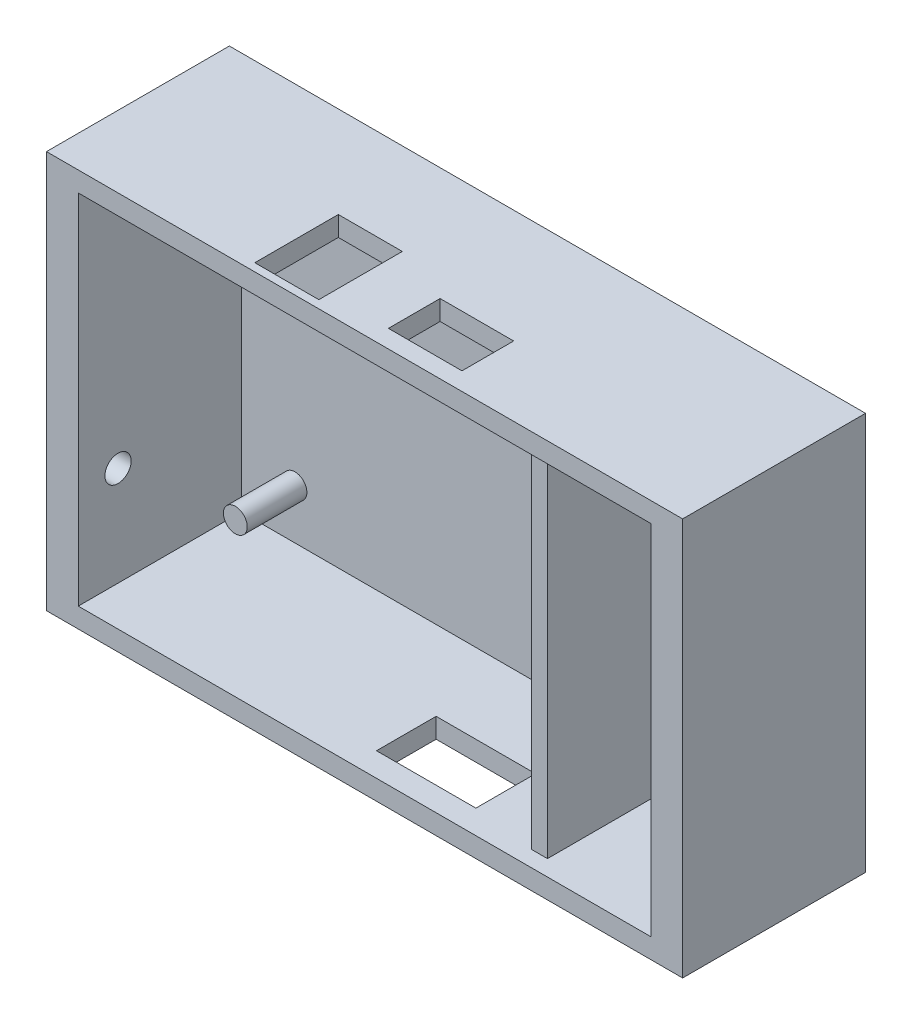
ISO-10303-21;
HEADER;
FILE_DESCRIPTION(('STEP AP214'),'2;1');
FILE_NAME('part.step','',(''),(''),'','','');
FILE_SCHEMA(('AUTOMOTIVE_DESIGN { 1 0 10303 214 1 1 1 1 }'));
ENDSEC;
DATA;
#1=APPLICATION_CONTEXT('core data for automotive mechanical design processes');
#2=APPLICATION_PROTOCOL_DEFINITION('international standard','automotive_design',2000,#1);
#3=PRODUCT_CONTEXT('',#1,'mechanical');
#4=PRODUCT('Part','Part','',(#3));
#5=PRODUCT_RELATED_PRODUCT_CATEGORY('part','',(#4));
#6=PRODUCT_DEFINITION_FORMATION('','',#4);
#7=PRODUCT_DEFINITION_CONTEXT('part definition',#1,'design');
#8=PRODUCT_DEFINITION('design','',#6,#7);
#9=PRODUCT_DEFINITION_SHAPE('','',#8);
#10=(LENGTH_UNIT() NAMED_UNIT(*) SI_UNIT(.MILLI.,.METRE.));
#11=(NAMED_UNIT(*) PLANE_ANGLE_UNIT() SI_UNIT($,.RADIAN.));
#12=(NAMED_UNIT(*) SI_UNIT($,.STERADIAN.) SOLID_ANGLE_UNIT());
#13=UNCERTAINTY_MEASURE_WITH_UNIT(LENGTH_MEASURE(1.E-05),#10,'distance_accuracy_value','');
#14=(GEOMETRIC_REPRESENTATION_CONTEXT(3) GLOBAL_UNCERTAINTY_ASSIGNED_CONTEXT((#13)) GLOBAL_UNIT_ASSIGNED_CONTEXT((#10,
#11,#12)) REPRESENTATION_CONTEXT('',''));
#15=CARTESIAN_POINT('',(0.,0.,0.));
#16=DIRECTION('',(0.,0.,1.));
#17=DIRECTION('',(1.,0.,0.));
#18=AXIS2_PLACEMENT_3D('',#15,#16,#17);
#19=CARTESIAN_POINT('',(72.,45.,46.));
#20=DIRECTION('',(0.,-1.,0.));
#21=DIRECTION('',(1.,0.,0.));
#22=AXIS2_PLACEMENT_3D('',#19,#20,#21);
#23=PLANE('',#22);
#24=DIRECTION('',(-1.,0.,0.));
#25=VECTOR('',#24,1.);
#26=CARTESIAN_POINT('',(-72.,45.,5.));
#27=LINE('',#26,#25);
#28=CARTESIAN_POINT('',(38.,45.,5.00000000000001));
#29=VERTEX_POINT('',#28);
#30=CARTESIAN_POINT('',(-72.,45.,5.));
#31=VERTEX_POINT('',#30);
#32=EDGE_CURVE('E354',#29,#31,#27,.T.);
#33=ORIENTED_EDGE('',*,*,#32,.F.);
#34=DIRECTION('',(0.,0.,-1.));
#35=VECTOR('',#34,1.);
#36=CARTESIAN_POINT('',(38.,45.,42.));
#37=LINE('',#36,#35);
#38=CARTESIAN_POINT('',(38.,45.,42.));
#39=VERTEX_POINT('',#38);
#40=EDGE_CURVE('E370',#39,#29,#37,.T.);
#41=ORIENTED_EDGE('',*,*,#40,.F.);
#42=DIRECTION('',(-1.,0.,0.));
#43=VECTOR('',#42,1.);
#44=CARTESIAN_POINT('',(38.,45.,42.));
#45=LINE('',#44,#43);
#46=CARTESIAN_POINT('',(42.,45.,42.));
#47=VERTEX_POINT('',#46);
#48=EDGE_CURVE('E373',#47,#39,#45,.T.);
#49=ORIENTED_EDGE('',*,*,#48,.F.);
#50=DIRECTION('',(0.,0.,-1.));
#51=VECTOR('',#50,1.);
#52=CARTESIAN_POINT('',(42.,45.,42.));
#53=LINE('',#52,#51);
#54=CARTESIAN_POINT('',(42.,45.,5.00000000000001));
#55=VERTEX_POINT('',#54);
#56=EDGE_CURVE('E366',#47,#55,#53,.T.);
#57=ORIENTED_EDGE('',*,*,#56,.T.);
#58=CARTESIAN_POINT('',(72.,45.,5.));
#59=VERTEX_POINT('',#58);
#60=EDGE_CURVE('E350',#59,#55,#27,.T.);
#61=ORIENTED_EDGE('',*,*,#60,.F.);
#62=DIRECTION('',(0.,0.,-1.));
#63=VECTOR('',#62,1.);
#64=CARTESIAN_POINT('',(72.,45.,46.));
#65=LINE('',#64,#63);
#66=CARTESIAN_POINT('',(72.,45.,46.));
#67=VERTEX_POINT('',#66);
#68=EDGE_CURVE('E320',#67,#59,#65,.T.);
#69=ORIENTED_EDGE('',*,*,#68,.F.);
#70=DIRECTION('',(-1.,0.,0.));
#71=VECTOR('',#70,1.);
#72=CARTESIAN_POINT('',(72.,45.,46.));
#73=LINE('',#72,#71);
#74=CARTESIAN_POINT('',(-72.,45.,46.));
#75=VERTEX_POINT('',#74);
#76=EDGE_CURVE('E328',#67,#75,#73,.T.);
#77=ORIENTED_EDGE('',*,*,#76,.T.);
#78=DIRECTION('',(0.,0.,-1.));
#79=VECTOR('',#78,1.);
#80=CARTESIAN_POINT('',(-72.,45.,46.));
#81=LINE('',#80,#79);
#82=EDGE_CURVE('E324',#75,#31,#81,.T.);
#83=ORIENTED_EDGE('',*,*,#82,.T.);
#84=EDGE_LOOP('',(#33,#41,#49,#57,#61,#69,#77,#83));
#85=FACE_BOUND('',#84,.T.);
#86=DIRECTION('',(-1.,0.,0.));
#87=VECTOR('',#86,1.);
#88=CARTESIAN_POINT('',(72.,45.,28.5));
#89=LINE('',#88,#87);
#90=CARTESIAN_POINT('',(20.,45.,28.5));
#91=VERTEX_POINT('',#90);
#92=CARTESIAN_POINT('',(1.5,45.,28.5));
#93=VERTEX_POINT('',#92);
#94=EDGE_CURVE('E399',#91,#93,#89,.T.);
#95=ORIENTED_EDGE('',*,*,#94,.T.);
#96=DIRECTION('',(0.,0.,1.));
#97=VECTOR('',#96,1.);
#98=CARTESIAN_POINT('',(1.5,45.,46.));
#99=LINE('',#98,#97);
#100=CARTESIAN_POINT('',(1.5,45.,41.5));
#101=VERTEX_POINT('',#100);
#102=EDGE_CURVE('E262',#93,#101,#99,.T.);
#103=ORIENTED_EDGE('',*,*,#102,.T.);
#104=DIRECTION('',(1.,0.,0.));
#105=VECTOR('',#104,1.);
#106=CARTESIAN_POINT('',(72.,45.,41.5));
#107=LINE('',#106,#105);
#108=CARTESIAN_POINT('',(20.,45.,41.5));
#109=VERTEX_POINT('',#108);
#110=EDGE_CURVE('E391',#101,#109,#107,.T.);
#111=ORIENTED_EDGE('',*,*,#110,.T.);
#112=DIRECTION('',(0.,0.,-1.));
#113=VECTOR('',#112,1.);
#114=CARTESIAN_POINT('',(20.,45.,46.));
#115=LINE('',#114,#113);
#116=EDGE_CURVE('E395',#109,#91,#115,.T.);
#117=ORIENTED_EDGE('',*,*,#116,.T.);
#118=EDGE_LOOP('',(#95,#103,#111,#117));
#119=FACE_BOUND('',#118,.T.);
#120=DIRECTION('',(-1.,0.,0.));
#121=VECTOR('',#120,1.);
#122=CARTESIAN_POINT('',(72.,45.,23.));
#123=LINE('',#122,#121);
#124=CARTESIAN_POINT('',(-13.5,45.,23.));
#125=VERTEX_POINT('',#124);
#126=CARTESIAN_POINT('',(-29.6,45.,23.));
#127=VERTEX_POINT('',#126);
#128=EDGE_CURVE('E462',#125,#127,#123,.T.);
#129=ORIENTED_EDGE('',*,*,#128,.T.);
#130=DIRECTION('',(0.,0.,1.));
#131=VECTOR('',#130,1.);
#132=CARTESIAN_POINT('',(-29.6,45.,46.));
#133=LINE('',#132,#131);
#134=CARTESIAN_POINT('',(-29.6,45.,44.));
#135=VERTEX_POINT('',#134);
#136=EDGE_CURVE('E450',#127,#135,#133,.T.);
#137=ORIENTED_EDGE('',*,*,#136,.T.);
#138=DIRECTION('',(1.,0.,0.));
#139=VECTOR('',#138,1.);
#140=CARTESIAN_POINT('',(72.,45.,44.));
#141=LINE('',#140,#139);
#142=CARTESIAN_POINT('',(-13.5,45.,44.));
#143=VERTEX_POINT('',#142);
#144=EDGE_CURVE('E454',#135,#143,#141,.T.);
#145=ORIENTED_EDGE('',*,*,#144,.T.);
#146=DIRECTION('',(0.,0.,-1.));
#147=VECTOR('',#146,1.);
#148=CARTESIAN_POINT('',(-13.5,45.,46.));
#149=LINE('',#148,#147);
#150=EDGE_CURVE('E458',#143,#125,#149,.T.);
#151=ORIENTED_EDGE('',*,*,#150,.T.);
#152=EDGE_LOOP('',(#129,#137,#145,#151));
#153=FACE_BOUND('',#152,.T.);
#154=ADVANCED_FACE('F45',(#85,#119,#153),#23,.T.);
#155=CARTESIAN_POINT('',(-80.,50.,46.));
#156=DIRECTION('',(0.,-1.,0.));
#157=DIRECTION('',(0.,0.,-1.));
#158=AXIS2_PLACEMENT_3D('',#155,#156,#157);
#159=PLANE('',#158);
#160=DIRECTION('',(0.,0.,1.));
#161=VECTOR('',#160,1.);
#162=CARTESIAN_POINT('',(1.5,50.,46.));
#163=LINE('',#162,#161);
#164=CARTESIAN_POINT('',(1.5,50.,28.5));
#165=VERTEX_POINT('',#164);
#166=CARTESIAN_POINT('',(1.5,50.,41.5));
#167=VERTEX_POINT('',#166);
#168=EDGE_CURVE('E243',#165,#167,#163,.T.);
#169=ORIENTED_EDGE('',*,*,#168,.F.);
#170=DIRECTION('',(-1.,0.,0.));
#171=VECTOR('',#170,1.);
#172=CARTESIAN_POINT('',(-80.,50.,28.5));
#173=LINE('',#172,#171);
#174=CARTESIAN_POINT('',(20.,50.,28.5));
#175=VERTEX_POINT('',#174);
#176=EDGE_CURVE('E253',#175,#165,#173,.T.);
#177=ORIENTED_EDGE('',*,*,#176,.F.);
#178=DIRECTION('',(0.,0.,-1.));
#179=VECTOR('',#178,1.);
#180=CARTESIAN_POINT('',(20.,50.,46.));
#181=LINE('',#180,#179);
#182=CARTESIAN_POINT('',(20.,50.,41.5));
#183=VERTEX_POINT('',#182);
#184=EDGE_CURVE('E249',#183,#175,#181,.T.);
#185=ORIENTED_EDGE('',*,*,#184,.F.);
#186=DIRECTION('',(1.,0.,0.));
#187=VECTOR('',#186,1.);
#188=CARTESIAN_POINT('',(-80.,50.,41.5));
#189=LINE('',#188,#187);
#190=EDGE_CURVE('E246',#167,#183,#189,.T.);
#191=ORIENTED_EDGE('',*,*,#190,.F.);
#192=EDGE_LOOP('',(#169,#177,#185,#191));
#193=FACE_BOUND('',#192,.T.);
#194=DIRECTION('',(-1.,0.,0.));
#195=VECTOR('',#194,1.);
#196=CARTESIAN_POINT('',(-80.,50.,0.));
#197=LINE('',#196,#195);
#198=CARTESIAN_POINT('',(80.,50.,0.));
#199=VERTEX_POINT('',#198);
#200=CARTESIAN_POINT('',(-80.,50.,0.));
#201=VERTEX_POINT('',#200);
#202=EDGE_CURVE('E294',#199,#201,#197,.T.);
#203=ORIENTED_EDGE('',*,*,#202,.T.);
#204=DIRECTION('',(0.,0.,-1.));
#205=VECTOR('',#204,1.);
#206=CARTESIAN_POINT('',(-80.,50.,46.));
#207=LINE('',#206,#205);
#208=CARTESIAN_POINT('',(-80.,50.,46.));
#209=VERTEX_POINT('',#208);
#210=EDGE_CURVE('E274',#209,#201,#207,.T.);
#211=ORIENTED_EDGE('',*,*,#210,.F.);
#212=DIRECTION('',(-1.,0.,0.));
#213=VECTOR('',#212,1.);
#214=CARTESIAN_POINT('',(-80.,50.,46.));
#215=LINE('',#214,#213);
#216=CARTESIAN_POINT('',(80.,50.,46.));
#217=VERTEX_POINT('',#216);
#218=EDGE_CURVE('E307',#217,#209,#215,.T.);
#219=ORIENTED_EDGE('',*,*,#218,.F.);
#220=DIRECTION('',(0.,0.,-1.));
#221=VECTOR('',#220,1.);
#222=CARTESIAN_POINT('',(80.,50.,46.));
#223=LINE('',#222,#221);
#224=EDGE_CURVE('E270',#217,#199,#223,.T.);
#225=ORIENTED_EDGE('',*,*,#224,.T.);
#226=EDGE_LOOP('',(#203,#211,#219,#225));
#227=FACE_BOUND('',#226,.T.);
#228=DIRECTION('',(0.,0.,1.));
#229=VECTOR('',#228,1.);
#230=CARTESIAN_POINT('',(-29.6,50.,46.));
#231=LINE('',#230,#229);
#232=CARTESIAN_POINT('',(-29.6,50.,23.));
#233=VERTEX_POINT('',#232);
#234=CARTESIAN_POINT('',(-29.6,50.,44.));
#235=VERTEX_POINT('',#234);
#236=EDGE_CURVE('E210',#233,#235,#231,.T.);
#237=ORIENTED_EDGE('',*,*,#236,.F.);
#238=DIRECTION('',(-1.,0.,0.));
#239=VECTOR('',#238,1.);
#240=CARTESIAN_POINT('',(-80.,50.,23.));
#241=LINE('',#240,#239);
#242=CARTESIAN_POINT('',(-13.5,50.,23.));
#243=VERTEX_POINT('',#242);
#244=EDGE_CURVE('E240',#243,#233,#241,.T.);
#245=ORIENTED_EDGE('',*,*,#244,.F.);
#246=DIRECTION('',(0.,0.,-1.));
#247=VECTOR('',#246,1.);
#248=CARTESIAN_POINT('',(-13.5,50.,46.));
#249=LINE('',#248,#247);
#250=CARTESIAN_POINT('',(-13.5,50.,44.));
#251=VERTEX_POINT('',#250);
#252=EDGE_CURVE('E236',#251,#243,#249,.T.);
#253=ORIENTED_EDGE('',*,*,#252,.F.);
#254=DIRECTION('',(1.,0.,0.));
#255=VECTOR('',#254,1.);
#256=CARTESIAN_POINT('',(-80.,50.,44.));
#257=LINE('',#256,#255);
#258=EDGE_CURVE('E233',#235,#251,#257,.T.);
#259=ORIENTED_EDGE('',*,*,#258,.F.);
#260=EDGE_LOOP('',(#237,#245,#253,#259));
#261=FACE_BOUND('',#260,.T.);
#262=ADVANCED_FACE('F517',(#193,#227,#261),#159,.F.);
#263=CARTESIAN_POINT('',(72.,-45.,46.));
#264=DIRECTION('',(0.,1.,0.));
#265=DIRECTION('',(-1.,0.,0.));
#266=AXIS2_PLACEMENT_3D('',#263,#264,#265);
#267=PLANE('',#266);
#268=DIRECTION('',(0.,0.,1.));
#269=VECTOR('',#268,1.);
#270=CARTESIAN_POINT('',(-3.,-45.,46.));
#271=LINE('',#270,#269);
#272=CARTESIAN_POINT('',(-3.,-45.,25.));
#273=VERTEX_POINT('',#272);
#274=CARTESIAN_POINT('',(-3.,-45.,40.));
#275=VERTEX_POINT('',#274);
#276=EDGE_CURVE('E217',#273,#275,#271,.T.);
#277=ORIENTED_EDGE('',*,*,#276,.F.);
#278=DIRECTION('',(-1.,0.,0.));
#279=VECTOR('',#278,1.);
#280=CARTESIAN_POINT('',(72.,-45.,25.));
#281=LINE('',#280,#279);
#282=CARTESIAN_POINT('',(22.,-45.,25.));
#283=VERTEX_POINT('',#282);
#284=EDGE_CURVE('E483',#283,#273,#281,.T.);
#285=ORIENTED_EDGE('',*,*,#284,.F.);
#286=DIRECTION('',(0.,0.,-1.));
#287=VECTOR('',#286,1.);
#288=CARTESIAN_POINT('',(22.,-45.,46.));
#289=LINE('',#288,#287);
#290=CARTESIAN_POINT('',(22.,-45.,40.));
#291=VERTEX_POINT('',#290);
#292=EDGE_CURVE('E486',#291,#283,#289,.T.);
#293=ORIENTED_EDGE('',*,*,#292,.F.);
#294=DIRECTION('',(1.,0.,0.));
#295=VECTOR('',#294,1.);
#296=CARTESIAN_POINT('',(72.,-45.,40.));
#297=LINE('',#296,#295);
#298=EDGE_CURVE('E489',#275,#291,#297,.T.);
#299=ORIENTED_EDGE('',*,*,#298,.F.);
#300=EDGE_LOOP('',(#277,#285,#293,#299));
#301=FACE_BOUND('',#300,.T.);
#302=DIRECTION('',(1.,0.,0.));
#303=VECTOR('',#302,1.);
#304=CARTESIAN_POINT('',(38.,-45.,42.));
#305=LINE('',#304,#303);
#306=CARTESIAN_POINT('',(38.,-45.,42.));
#307=VERTEX_POINT('',#306);
#308=CARTESIAN_POINT('',(42.,-45.,42.));
#309=VERTEX_POINT('',#308);
#310=EDGE_CURVE('E379',#307,#309,#305,.T.);
#311=ORIENTED_EDGE('',*,*,#310,.F.);
#312=DIRECTION('',(0.,0.,-1.));
#313=VECTOR('',#312,1.);
#314=CARTESIAN_POINT('',(38.,-45.,42.));
#315=LINE('',#314,#313);
#316=CARTESIAN_POINT('',(38.,-45.,5.00000000000001));
#317=VERTEX_POINT('',#316);
#318=EDGE_CURVE('E359',#307,#317,#315,.T.);
#319=ORIENTED_EDGE('',*,*,#318,.T.);
#320=DIRECTION('',(1.,0.,0.));
#321=VECTOR('',#320,1.);
#322=CARTESIAN_POINT('',(-72.,-45.,5.));
#323=LINE('',#322,#321);
#324=CARTESIAN_POINT('',(-72.,-45.,5.));
#325=VERTEX_POINT('',#324);
#326=EDGE_CURVE('E341',#325,#317,#323,.T.);
#327=ORIENTED_EDGE('',*,*,#326,.F.);
#328=DIRECTION('',(0.,0.,-1.));
#329=VECTOR('',#328,1.);
#330=CARTESIAN_POINT('',(-72.,-45.,46.));
#331=LINE('',#330,#329);
#332=CARTESIAN_POINT('',(-72.,-45.,46.));
#333=VERTEX_POINT('',#332);
#334=EDGE_CURVE('E301',#333,#325,#331,.T.);
#335=ORIENTED_EDGE('',*,*,#334,.F.);
#336=DIRECTION('',(1.,0.,0.));
#337=VECTOR('',#336,1.);
#338=CARTESIAN_POINT('',(72.,-45.,46.));
#339=LINE('',#338,#337);
#340=CARTESIAN_POINT('',(72.,-45.,46.));
#341=VERTEX_POINT('',#340);
#342=EDGE_CURVE('E335',#333,#341,#339,.T.);
#343=ORIENTED_EDGE('',*,*,#342,.T.);
#344=DIRECTION('',(0.,0.,-1.));
#345=VECTOR('',#344,1.);
#346=CARTESIAN_POINT('',(72.,-45.,46.));
#347=LINE('',#346,#345);
#348=CARTESIAN_POINT('',(72.,-45.,5.));
#349=VERTEX_POINT('',#348);
#350=EDGE_CURVE('E316',#341,#349,#347,.T.);
#351=ORIENTED_EDGE('',*,*,#350,.T.);
#352=CARTESIAN_POINT('',(42.,-45.,5.));
#353=VERTEX_POINT('',#352);
#354=EDGE_CURVE('E345',#353,#349,#323,.T.);
#355=ORIENTED_EDGE('',*,*,#354,.F.);
#356=DIRECTION('',(0.,0.,-1.));
#357=VECTOR('',#356,1.);
#358=CARTESIAN_POINT('',(42.,-45.,42.));
#359=LINE('',#358,#357);
#360=EDGE_CURVE('E363',#309,#353,#359,.T.);
#361=ORIENTED_EDGE('',*,*,#360,.F.);
#362=EDGE_LOOP('',(#311,#319,#327,#335,#343,#351,#355,#361));
#363=FACE_BOUND('',#362,.T.);
#364=ADVANCED_FACE('F501',(#301,#363),#267,.T.);
#365=CARTESIAN_POINT('',(0.,0.,5.));
#366=DIRECTION('',(0.,0.,1.));
#367=DIRECTION('',(1.,0.,0.));
#368=AXIS2_PLACEMENT_3D('',#365,#366,#367);
#369=PLANE('',#368);
#370=CARTESIAN_POINT('',(24.5,32.5,5.));
#371=DIRECTION('',(0.,0.,1.));
#372=DIRECTION('',(1.,0.,0.));
#373=AXIS2_PLACEMENT_3D('',#370,#371,#372);
#374=CIRCLE('',#373,3.);
#375=CARTESIAN_POINT('',(27.5,32.5,5.));
#376=VERTEX_POINT('',#375);
#377=EDGE_CURVE('E418',#376,#376,#374,.F.);
#378=ORIENTED_EDGE('',*,*,#377,.T.);
#379=EDGE_LOOP('',(#378));
#380=FACE_BOUND('',#379,.T.);
#381=CARTESIAN_POINT('',(-58.5,-32.5,5.));
#382=DIRECTION('',(0.,0.,1.));
#383=DIRECTION('',(1.,0.,0.));
#384=AXIS2_PLACEMENT_3D('',#381,#382,#383);
#385=CIRCLE('',#384,3.);
#386=CARTESIAN_POINT('',(-55.5,-32.5,5.));
#387=VERTEX_POINT('',#386);
#388=EDGE_CURVE('E422',#387,#387,#385,.F.);
#389=ORIENTED_EDGE('',*,*,#388,.T.);
#390=EDGE_LOOP('',(#389));
#391=FACE_BOUND('',#390,.T.);
#392=CARTESIAN_POINT('',(24.5,-32.5,5.));
#393=DIRECTION('',(0.,0.,1.));
#394=DIRECTION('',(1.,0.,0.));
#395=AXIS2_PLACEMENT_3D('',#392,#393,#394);
#396=CIRCLE('',#395,3.);
#397=CARTESIAN_POINT('',(27.5,-32.5,5.));
#398=VERTEX_POINT('',#397);
#399=EDGE_CURVE('E426',#398,#398,#396,.F.);
#400=ORIENTED_EDGE('',*,*,#399,.T.);
#401=EDGE_LOOP('',(#400));
#402=FACE_BOUND('',#401,.T.);
#403=CARTESIAN_POINT('',(-58.5,32.5,5.));
#404=DIRECTION('',(0.,0.,1.));
#405=DIRECTION('',(1.,0.,0.));
#406=AXIS2_PLACEMENT_3D('',#403,#404,#405);
#407=CIRCLE('',#406,3.);
#408=CARTESIAN_POINT('',(-55.5,32.5,5.));
#409=VERTEX_POINT('',#408);
#410=EDGE_CURVE('E430',#409,#409,#407,.F.);
#411=ORIENTED_EDGE('',*,*,#410,.T.);
#412=EDGE_LOOP('',(#411));
#413=FACE_BOUND('',#412,.T.);
#414=ORIENTED_EDGE('',*,*,#326,.T.);
#415=DIRECTION('',(0.,1.,0.));
#416=VECTOR('',#415,1.);
#417=CARTESIAN_POINT('',(38.,0.,5.));
#418=LINE('',#417,#416);
#419=EDGE_CURVE('E256',#317,#29,#418,.T.);
#420=ORIENTED_EDGE('',*,*,#419,.T.);
#421=ORIENTED_EDGE('',*,*,#32,.T.);
#422=DIRECTION('',(0.,-1.,0.));
#423=VECTOR('',#422,1.);
#424=CARTESIAN_POINT('',(-72.,45.,5.));
#425=LINE('',#424,#423);
#426=EDGE_CURVE('E346',#31,#325,#425,.T.);
#427=ORIENTED_EDGE('',*,*,#426,.T.);
#428=EDGE_LOOP('',(#414,#420,#421,#427));
#429=FACE_BOUND('',#428,.T.);
#430=ADVANCED_FACE('F529',(#380,#391,#402,#413,#429),#369,.T.);
#431=ORIENTED_EDGE('',*,*,#60,.T.);
#432=DIRECTION('',(0.,-1.,0.));
#433=VECTOR('',#432,1.);
#434=CARTESIAN_POINT('',(42.,0.,5.));
#435=LINE('',#434,#433);
#436=EDGE_CURVE('E266',#55,#353,#435,.T.);
#437=ORIENTED_EDGE('',*,*,#436,.T.);
#438=ORIENTED_EDGE('',*,*,#354,.T.);
#439=DIRECTION('',(0.,1.,0.));
#440=VECTOR('',#439,1.);
#441=CARTESIAN_POINT('',(72.,45.,5.));
#442=LINE('',#441,#440);
#443=EDGE_CURVE('E355',#349,#59,#442,.T.);
#444=ORIENTED_EDGE('',*,*,#443,.T.);
#445=EDGE_LOOP('',(#431,#437,#438,#444));
#446=FACE_BOUND('',#445,.T.);
#447=ADVANCED_FACE('F546',(#446),#369,.T.);
#448=CARTESIAN_POINT('',(0.,0.,46.));
#449=DIRECTION('',(0.,0.,1.));
#450=DIRECTION('',(1.,0.,0.));
#451=AXIS2_PLACEMENT_3D('',#448,#449,#450);
#452=PLANE('',#451);
#453=DIRECTION('',(0.,1.,0.));
#454=VECTOR('',#453,1.);
#455=CARTESIAN_POINT('',(80.,50.,46.));
#456=LINE('',#455,#454);
#457=CARTESIAN_POINT('',(80.,-50.,46.));
#458=VERTEX_POINT('',#457);
#459=EDGE_CURVE('E290',#458,#217,#456,.T.);
#460=ORIENTED_EDGE('',*,*,#459,.T.);
#461=ORIENTED_EDGE('',*,*,#218,.T.);
#462=DIRECTION('',(0.,-1.,0.));
#463=VECTOR('',#462,1.);
#464=CARTESIAN_POINT('',(-80.,50.,46.));
#465=LINE('',#464,#463);
#466=CARTESIAN_POINT('',(-80.,-50.,46.));
#467=VERTEX_POINT('',#466);
#468=EDGE_CURVE('E304',#209,#467,#465,.T.);
#469=ORIENTED_EDGE('',*,*,#468,.T.);
#470=DIRECTION('',(1.,0.,0.));
#471=VECTOR('',#470,1.);
#472=CARTESIAN_POINT('',(-80.,-50.,46.));
#473=LINE('',#472,#471);
#474=EDGE_CURVE('E286',#467,#458,#473,.T.);
#475=ORIENTED_EDGE('',*,*,#474,.T.);
#476=EDGE_LOOP('',(#460,#461,#469,#475));
#477=FACE_BOUND('',#476,.T.);
#478=ORIENTED_EDGE('',*,*,#342,.F.);
#479=DIRECTION('',(0.,-1.,0.));
#480=VECTOR('',#479,1.);
#481=CARTESIAN_POINT('',(-72.,45.,46.));
#482=LINE('',#481,#480);
#483=EDGE_CURVE('E338',#75,#333,#482,.T.);
#484=ORIENTED_EDGE('',*,*,#483,.F.);
#485=ORIENTED_EDGE('',*,*,#76,.F.);
#486=DIRECTION('',(0.,1.,0.));
#487=VECTOR('',#486,1.);
#488=CARTESIAN_POINT('',(72.,45.,46.));
#489=LINE('',#488,#487);
#490=EDGE_CURVE('E331',#341,#67,#489,.T.);
#491=ORIENTED_EDGE('',*,*,#490,.F.);
#492=EDGE_LOOP('',(#478,#484,#485,#491));
#493=FACE_BOUND('',#492,.T.);
#494=ADVANCED_FACE('F542',(#477,#493),#452,.T.);
#495=CARTESIAN_POINT('',(0.,0.,0.));
#496=DIRECTION('',(0.,0.,1.));
#497=DIRECTION('',(1.,0.,0.));
#498=AXIS2_PLACEMENT_3D('',#495,#496,#497);
#499=PLANE('',#498);
#500=DIRECTION('',(0.,1.,0.));
#501=VECTOR('',#500,1.);
#502=CARTESIAN_POINT('',(80.,50.,0.));
#503=LINE('',#502,#501);
#504=CARTESIAN_POINT('',(80.,-50.,0.));
#505=VERTEX_POINT('',#504);
#506=EDGE_CURVE('E297',#505,#199,#503,.T.);
#507=ORIENTED_EDGE('',*,*,#506,.F.);
#508=DIRECTION('',(1.,0.,0.));
#509=VECTOR('',#508,1.);
#510=CARTESIAN_POINT('',(-80.,-50.,0.));
#511=LINE('',#510,#509);
#512=CARTESIAN_POINT('',(-80.,-50.,0.));
#513=VERTEX_POINT('',#512);
#514=EDGE_CURVE('E287',#513,#505,#511,.T.);
#515=ORIENTED_EDGE('',*,*,#514,.F.);
#516=DIRECTION('',(0.,-1.,0.));
#517=VECTOR('',#516,1.);
#518=CARTESIAN_POINT('',(-80.,50.,0.));
#519=LINE('',#518,#517);
#520=EDGE_CURVE('E291',#201,#513,#519,.T.);
#521=ORIENTED_EDGE('',*,*,#520,.F.);
#522=ORIENTED_EDGE('',*,*,#202,.F.);
#523=EDGE_LOOP('',(#507,#515,#521,#522));
#524=FACE_BOUND('',#523,.T.);
#525=ADVANCED_FACE('F545',(#524),#499,.F.);
#526=CARTESIAN_POINT('',(80.,50.,46.));
#527=DIRECTION('',(-1.,0.,0.));
#528=DIRECTION('',(0.,0.,1.));
#529=AXIS2_PLACEMENT_3D('',#526,#527,#528);
#530=PLANE('',#529);
#531=ORIENTED_EDGE('',*,*,#506,.T.);
#532=ORIENTED_EDGE('',*,*,#224,.F.);
#533=ORIENTED_EDGE('',*,*,#459,.F.);
#534=DIRECTION('',(0.,0.,-1.));
#535=VECTOR('',#534,1.);
#536=CARTESIAN_POINT('',(80.,-50.,46.));
#537=LINE('',#536,#535);
#538=EDGE_CURVE('E282',#458,#505,#537,.T.);
#539=ORIENTED_EDGE('',*,*,#538,.T.);
#540=EDGE_LOOP('',(#531,#532,#533,#539));
#541=FACE_BOUND('',#540,.T.);
#542=ADVANCED_FACE('F47',(#541),#530,.F.);
#543=CARTESIAN_POINT('',(-80.,50.,46.));
#544=DIRECTION('',(1.,0.,0.));
#545=DIRECTION('',(0.,0.,-1.));
#546=AXIS2_PLACEMENT_3D('',#543,#544,#545);
#547=PLANE('',#546);
#548=CARTESIAN_POINT('',(-80.,-20.,36.));
#549=DIRECTION('',(1.,0.,0.));
#550=DIRECTION('',(0.,0.,-1.));
#551=AXIS2_PLACEMENT_3D('',#548,#549,#550);
#552=CIRCLE('',#551,3.3);
#553=CARTESIAN_POINT('',(-80.,-20.,32.7));
#554=VERTEX_POINT('',#553);
#555=EDGE_CURVE('E261',#554,#554,#552,.T.);
#556=ORIENTED_EDGE('',*,*,#555,.T.);
#557=EDGE_LOOP('',(#556));
#558=FACE_BOUND('',#557,.T.);
#559=ORIENTED_EDGE('',*,*,#520,.T.);
#560=DIRECTION('',(0.,0.,-1.));
#561=VECTOR('',#560,1.);
#562=CARTESIAN_POINT('',(-80.,-50.,46.));
#563=LINE('',#562,#561);
#564=EDGE_CURVE('E278',#467,#513,#563,.T.);
#565=ORIENTED_EDGE('',*,*,#564,.F.);
#566=ORIENTED_EDGE('',*,*,#468,.F.);
#567=ORIENTED_EDGE('',*,*,#210,.T.);
#568=EDGE_LOOP('',(#559,#565,#566,#567));
#569=FACE_BOUND('',#568,.T.);
#570=ADVANCED_FACE('F553',(#558,#569),#547,.F.);
#571=CARTESIAN_POINT('',(-80.,-50.,46.));
#572=DIRECTION('',(0.,1.,0.));
#573=DIRECTION('',(0.,0.,1.));
#574=AXIS2_PLACEMENT_3D('',#571,#572,#573);
#575=PLANE('',#574);
#576=DIRECTION('',(-1.,0.,0.));
#577=VECTOR('',#576,1.);
#578=CARTESIAN_POINT('',(-80.,-50.,25.));
#579=LINE('',#578,#577);
#580=CARTESIAN_POINT('',(22.,-50.,25.));
#581=VERTEX_POINT('',#580);
#582=CARTESIAN_POINT('',(-3.,-50.,25.));
#583=VERTEX_POINT('',#582);
#584=EDGE_CURVE('E54',#581,#583,#579,.T.);
#585=ORIENTED_EDGE('',*,*,#584,.T.);
#586=DIRECTION('',(0.,0.,1.));
#587=VECTOR('',#586,1.);
#588=CARTESIAN_POINT('',(-3.,-50.,46.));
#589=LINE('',#588,#587);
#590=CARTESIAN_POINT('',(-3.,-50.,40.));
#591=VERTEX_POINT('',#590);
#592=EDGE_CURVE('E11',#583,#591,#589,.T.);
#593=ORIENTED_EDGE('',*,*,#592,.T.);
#594=DIRECTION('',(1.,0.,0.));
#595=VECTOR('',#594,1.);
#596=CARTESIAN_POINT('',(-80.,-50.,40.));
#597=LINE('',#596,#595);
#598=CARTESIAN_POINT('',(22.,-50.,40.));
#599=VERTEX_POINT('',#598);
#600=EDGE_CURVE('E204',#591,#599,#597,.T.);
#601=ORIENTED_EDGE('',*,*,#600,.T.);
#602=DIRECTION('',(0.,0.,-1.));
#603=VECTOR('',#602,1.);
#604=CARTESIAN_POINT('',(22.,-50.,46.));
#605=LINE('',#604,#603);
#606=EDGE_CURVE('E209',#599,#581,#605,.T.);
#607=ORIENTED_EDGE('',*,*,#606,.T.);
#608=EDGE_LOOP('',(#585,#593,#601,#607));
#609=FACE_BOUND('',#608,.T.);
#610=ORIENTED_EDGE('',*,*,#514,.T.);
#611=ORIENTED_EDGE('',*,*,#538,.F.);
#612=ORIENTED_EDGE('',*,*,#474,.F.);
#613=ORIENTED_EDGE('',*,*,#564,.T.);
#614=EDGE_LOOP('',(#610,#611,#612,#613));
#615=FACE_BOUND('',#614,.T.);
#616=ADVANCED_FACE('F222',(#609,#615),#575,.F.);
#617=CARTESIAN_POINT('',(-72.,45.,46.));
#618=DIRECTION('',(1.,0.,0.));
#619=DIRECTION('',(0.,1.,0.));
#620=AXIS2_PLACEMENT_3D('',#617,#618,#619);
#621=PLANE('',#620);
#622=CARTESIAN_POINT('',(-72.,-20.,36.));
#623=DIRECTION('',(1.,0.,0.));
#624=DIRECTION('',(0.,1.,0.));
#625=AXIS2_PLACEMENT_3D('',#622,#623,#624);
#626=CIRCLE('',#625,3.3);
#627=CARTESIAN_POINT('',(-72.,-16.7,36.));
#628=VERTEX_POINT('',#627);
#629=EDGE_CURVE('E257',#628,#628,#626,.T.);
#630=ORIENTED_EDGE('',*,*,#629,.F.);
#631=EDGE_LOOP('',(#630));
#632=FACE_BOUND('',#631,.T.);
#633=ORIENTED_EDGE('',*,*,#426,.F.);
#634=ORIENTED_EDGE('',*,*,#82,.F.);
#635=ORIENTED_EDGE('',*,*,#483,.T.);
#636=ORIENTED_EDGE('',*,*,#334,.T.);
#637=EDGE_LOOP('',(#633,#634,#635,#636));
#638=FACE_BOUND('',#637,.T.);
#639=ADVANCED_FACE('F535',(#632,#638),#621,.T.);
#640=CARTESIAN_POINT('',(72.,45.,46.));
#641=DIRECTION('',(-1.,0.,0.));
#642=DIRECTION('',(0.,-1.,0.));
#643=AXIS2_PLACEMENT_3D('',#640,#641,#642);
#644=PLANE('',#643);
#645=ORIENTED_EDGE('',*,*,#443,.F.);
#646=ORIENTED_EDGE('',*,*,#350,.F.);
#647=ORIENTED_EDGE('',*,*,#490,.T.);
#648=ORIENTED_EDGE('',*,*,#68,.T.);
#649=EDGE_LOOP('',(#645,#646,#647,#648));
#650=FACE_BOUND('',#649,.T.);
#651=ADVANCED_FACE('F531',(#650),#644,.T.);
#652=CARTESIAN_POINT('',(38.,45.,42.));
#653=DIRECTION('',(1.,0.,0.));
#654=DIRECTION('',(0.,1.,0.));
#655=AXIS2_PLACEMENT_3D('',#652,#653,#654);
#656=PLANE('',#655);
#657=ORIENTED_EDGE('',*,*,#419,.F.);
#658=ORIENTED_EDGE('',*,*,#318,.F.);
#659=DIRECTION('',(0.,-1.,0.));
#660=VECTOR('',#659,1.);
#661=CARTESIAN_POINT('',(38.,45.,42.));
#662=LINE('',#661,#660);
#663=EDGE_CURVE('E382',#39,#307,#662,.T.);
#664=ORIENTED_EDGE('',*,*,#663,.F.);
#665=ORIENTED_EDGE('',*,*,#40,.T.);
#666=EDGE_LOOP('',(#657,#658,#664,#665));
#667=FACE_BOUND('',#666,.T.);
#668=ADVANCED_FACE('F534',(#667),#656,.F.);
#669=CARTESIAN_POINT('',(42.,45.,42.));
#670=DIRECTION('',(-1.,0.,0.));
#671=DIRECTION('',(0.,-1.,0.));
#672=AXIS2_PLACEMENT_3D('',#669,#670,#671);
#673=PLANE('',#672);
#674=ORIENTED_EDGE('',*,*,#436,.F.);
#675=ORIENTED_EDGE('',*,*,#56,.F.);
#676=DIRECTION('',(0.,1.,0.));
#677=VECTOR('',#676,1.);
#678=CARTESIAN_POINT('',(42.,45.,42.));
#679=LINE('',#678,#677);
#680=EDGE_CURVE('E376',#309,#47,#679,.T.);
#681=ORIENTED_EDGE('',*,*,#680,.F.);
#682=ORIENTED_EDGE('',*,*,#360,.T.);
#683=EDGE_LOOP('',(#674,#675,#681,#682));
#684=FACE_BOUND('',#683,.T.);
#685=ADVANCED_FACE('F656',(#684),#673,.F.);
#686=CARTESIAN_POINT('',(0.,0.,42.));
#687=DIRECTION('',(0.,0.,1.));
#688=DIRECTION('',(1.,0.,0.));
#689=AXIS2_PLACEMENT_3D('',#686,#687,#688);
#690=PLANE('',#689);
#691=ORIENTED_EDGE('',*,*,#663,.T.);
#692=ORIENTED_EDGE('',*,*,#310,.T.);
#693=ORIENTED_EDGE('',*,*,#680,.T.);
#694=ORIENTED_EDGE('',*,*,#48,.T.);
#695=EDGE_LOOP('',(#691,#692,#693,#694));
#696=FACE_BOUND('',#695,.T.);
#697=ADVANCED_FACE('F653',(#696),#690,.T.);
#698=CARTESIAN_POINT('',(-92.,-20.,36.));
#699=DIRECTION('',(1.,0.,0.));
#700=DIRECTION('',(0.,0.,-1.));
#701=AXIS2_PLACEMENT_3D('',#698,#699,#700);
#702=CYLINDRICAL_SURFACE('',#701,3.3);
#703=ORIENTED_EDGE('',*,*,#629,.T.);
#704=EDGE_LOOP('',(#703));
#705=FACE_BOUND('',#704,.T.);
#706=ORIENTED_EDGE('',*,*,#555,.F.);
#707=EDGE_LOOP('',(#706));
#708=FACE_BOUND('',#707,.T.);
#709=ADVANCED_FACE('F649',(#705,#708),#702,.F.);
#710=CARTESIAN_POINT('',(1.5,92.,28.5));
#711=DIRECTION('',(1.,0.,0.));
#712=DIRECTION('',(0.,0.,-1.));
#713=AXIS2_PLACEMENT_3D('',#710,#711,#712);
#714=PLANE('',#713);
#715=DIRECTION('',(0.,-1.,0.));
#716=VECTOR('',#715,1.);
#717=CARTESIAN_POINT('',(1.5,92.,28.5));
#718=LINE('',#717,#716);
#719=EDGE_CURVE('E415',#165,#93,#718,.T.);
#720=ORIENTED_EDGE('',*,*,#719,.F.);
#721=ORIENTED_EDGE('',*,*,#168,.T.);
#722=DIRECTION('',(0.,-1.,0.));
#723=VECTOR('',#722,1.);
#724=CARTESIAN_POINT('',(1.5,92.,41.5));
#725=LINE('',#724,#723);
#726=EDGE_CURVE('E403',#167,#101,#725,.T.);
#727=ORIENTED_EDGE('',*,*,#726,.T.);
#728=ORIENTED_EDGE('',*,*,#102,.F.);
#729=EDGE_LOOP('',(#720,#721,#727,#728));
#730=FACE_BOUND('',#729,.T.);
#731=ADVANCED_FACE('F645',(#730),#714,.T.);
#732=CARTESIAN_POINT('',(1.5,92.,41.5));
#733=DIRECTION('',(0.,0.,-1.));
#734=DIRECTION('',(-1.,0.,0.));
#735=AXIS2_PLACEMENT_3D('',#732,#733,#734);
#736=PLANE('',#735);
#737=ORIENTED_EDGE('',*,*,#726,.F.);
#738=ORIENTED_EDGE('',*,*,#190,.T.);
#739=DIRECTION('',(0.,-1.,0.));
#740=VECTOR('',#739,1.);
#741=CARTESIAN_POINT('',(20.,92.,41.5));
#742=LINE('',#741,#740);
#743=EDGE_CURVE('E407',#183,#109,#742,.T.);
#744=ORIENTED_EDGE('',*,*,#743,.T.);
#745=ORIENTED_EDGE('',*,*,#110,.F.);
#746=EDGE_LOOP('',(#737,#738,#744,#745));
#747=FACE_BOUND('',#746,.T.);
#748=ADVANCED_FACE('F641',(#747),#736,.T.);
#749=CARTESIAN_POINT('',(20.,92.,28.5));
#750=DIRECTION('',(-1.,0.,0.));
#751=DIRECTION('',(0.,0.,1.));
#752=AXIS2_PLACEMENT_3D('',#749,#750,#751);
#753=PLANE('',#752);
#754=ORIENTED_EDGE('',*,*,#743,.F.);
#755=ORIENTED_EDGE('',*,*,#184,.T.);
#756=DIRECTION('',(0.,-1.,0.));
#757=VECTOR('',#756,1.);
#758=CARTESIAN_POINT('',(20.,92.,28.5));
#759=LINE('',#758,#757);
#760=EDGE_CURVE('E411',#175,#91,#759,.T.);
#761=ORIENTED_EDGE('',*,*,#760,.T.);
#762=ORIENTED_EDGE('',*,*,#116,.F.);
#763=EDGE_LOOP('',(#754,#755,#761,#762));
#764=FACE_BOUND('',#763,.T.);
#765=ADVANCED_FACE('F637',(#764),#753,.T.);
#766=CARTESIAN_POINT('',(1.5,92.,28.5));
#767=DIRECTION('',(0.,0.,1.));
#768=DIRECTION('',(1.,0.,0.));
#769=AXIS2_PLACEMENT_3D('',#766,#767,#768);
#770=PLANE('',#769);
#771=ORIENTED_EDGE('',*,*,#760,.F.);
#772=ORIENTED_EDGE('',*,*,#176,.T.);
#773=ORIENTED_EDGE('',*,*,#719,.T.);
#774=ORIENTED_EDGE('',*,*,#94,.F.);
#775=EDGE_LOOP('',(#771,#772,#773,#774));
#776=FACE_BOUND('',#775,.T.);
#777=ADVANCED_FACE('F633',(#776),#770,.T.);
#778=CARTESIAN_POINT('',(-58.5,32.5,20.));
#779=DIRECTION('',(0.,0.,-1.));
#780=DIRECTION('',(-1.,0.,0.));
#781=AXIS2_PLACEMENT_3D('',#778,#779,#780);
#782=CYLINDRICAL_SURFACE('',#781,3.);
#783=ORIENTED_EDGE('',*,*,#410,.F.);
#784=EDGE_LOOP('',(#783));
#785=FACE_BOUND('',#784,.T.);
#786=CARTESIAN_POINT('',(-58.5,32.5,20.));
#787=DIRECTION('',(0.,0.,1.));
#788=DIRECTION('',(1.,0.,0.));
#789=AXIS2_PLACEMENT_3D('',#786,#787,#788);
#790=CIRCLE('',#789,3.);
#791=CARTESIAN_POINT('',(-55.5,32.5,20.));
#792=VERTEX_POINT('',#791);
#793=EDGE_CURVE('E434',#792,#792,#790,.T.);
#794=ORIENTED_EDGE('',*,*,#793,.F.);
#795=EDGE_LOOP('',(#794));
#796=FACE_BOUND('',#795,.T.);
#797=ADVANCED_FACE('F629',(#785,#796),#782,.T.);
#798=CARTESIAN_POINT('',(-58.5,32.5,20.));
#799=DIRECTION('',(0.,0.,1.));
#800=DIRECTION('',(1.,0.,0.));
#801=AXIS2_PLACEMENT_3D('',#798,#799,#800);
#802=PLANE('',#801);
#803=ORIENTED_EDGE('',*,*,#793,.T.);
#804=EDGE_LOOP('',(#803));
#805=FACE_BOUND('',#804,.T.);
#806=ADVANCED_FACE('F608',(#805),#802,.T.);
#807=CARTESIAN_POINT('',(24.5,-32.5,20.));
#808=DIRECTION('',(0.,0.,-1.));
#809=DIRECTION('',(-1.,0.,0.));
#810=AXIS2_PLACEMENT_3D('',#807,#808,#809);
#811=CYLINDRICAL_SURFACE('',#810,3.);
#812=ORIENTED_EDGE('',*,*,#399,.F.);
#813=EDGE_LOOP('',(#812));
#814=FACE_BOUND('',#813,.T.);
#815=CARTESIAN_POINT('',(24.5,-32.5,20.));
#816=DIRECTION('',(0.,0.,1.));
#817=DIRECTION('',(1.,0.,0.));
#818=AXIS2_PLACEMENT_3D('',#815,#816,#817);
#819=CIRCLE('',#818,3.);
#820=CARTESIAN_POINT('',(27.5,-32.5,20.));
#821=VERTEX_POINT('',#820);
#822=EDGE_CURVE('E443',#821,#821,#819,.T.);
#823=ORIENTED_EDGE('',*,*,#822,.F.);
#824=EDGE_LOOP('',(#823));
#825=FACE_BOUND('',#824,.T.);
#826=ADVANCED_FACE('F604',(#814,#825),#811,.T.);
#827=CARTESIAN_POINT('',(24.5,-32.5,20.));
#828=DIRECTION('',(0.,0.,1.));
#829=DIRECTION('',(1.,0.,0.));
#830=AXIS2_PLACEMENT_3D('',#827,#828,#829);
#831=PLANE('',#830);
#832=ORIENTED_EDGE('',*,*,#822,.T.);
#833=EDGE_LOOP('',(#832));
#834=FACE_BOUND('',#833,.T.);
#835=ADVANCED_FACE('F607',(#834),#831,.T.);
#836=CARTESIAN_POINT('',(-58.5,-32.5,20.));
#837=DIRECTION('',(0.,0.,-1.));
#838=DIRECTION('',(-1.,0.,0.));
#839=AXIS2_PLACEMENT_3D('',#836,#837,#838);
#840=CYLINDRICAL_SURFACE('',#839,3.);
#841=ORIENTED_EDGE('',*,*,#388,.F.);
#842=EDGE_LOOP('',(#841));
#843=FACE_BOUND('',#842,.T.);
#844=CARTESIAN_POINT('',(-58.5,-32.5,20.));
#845=DIRECTION('',(0.,0.,1.));
#846=DIRECTION('',(1.,0.,0.));
#847=AXIS2_PLACEMENT_3D('',#844,#845,#846);
#848=CIRCLE('',#847,3.);
#849=CARTESIAN_POINT('',(-55.5,-32.5,20.));
#850=VERTEX_POINT('',#849);
#851=EDGE_CURVE('E439',#850,#850,#848,.T.);
#852=ORIENTED_EDGE('',*,*,#851,.F.);
#853=EDGE_LOOP('',(#852));
#854=FACE_BOUND('',#853,.T.);
#855=ADVANCED_FACE('F612',(#843,#854),#840,.T.);
#856=CARTESIAN_POINT('',(-58.5,-32.5,20.));
#857=DIRECTION('',(0.,0.,1.));
#858=DIRECTION('',(1.,0.,0.));
#859=AXIS2_PLACEMENT_3D('',#856,#857,#858);
#860=PLANE('',#859);
#861=ORIENTED_EDGE('',*,*,#851,.T.);
#862=EDGE_LOOP('',(#861));
#863=FACE_BOUND('',#862,.T.);
#864=ADVANCED_FACE('F617',(#863),#860,.T.);
#865=CARTESIAN_POINT('',(24.5,32.5,20.));
#866=DIRECTION('',(0.,0.,-1.));
#867=DIRECTION('',(-1.,0.,0.));
#868=AXIS2_PLACEMENT_3D('',#865,#866,#867);
#869=CYLINDRICAL_SURFACE('',#868,3.);
#870=ORIENTED_EDGE('',*,*,#377,.F.);
#871=EDGE_LOOP('',(#870));
#872=FACE_BOUND('',#871,.T.);
#873=CARTESIAN_POINT('',(24.5,32.5,20.));
#874=DIRECTION('',(0.,0.,1.));
#875=DIRECTION('',(1.,0.,0.));
#876=AXIS2_PLACEMENT_3D('',#873,#874,#875);
#877=CIRCLE('',#876,3.);
#878=CARTESIAN_POINT('',(27.5,32.5,20.));
#879=VERTEX_POINT('',#878);
#880=EDGE_CURVE('E438',#879,#879,#877,.T.);
#881=ORIENTED_EDGE('',*,*,#880,.F.);
#882=EDGE_LOOP('',(#881));
#883=FACE_BOUND('',#882,.T.);
#884=ADVANCED_FACE('F614',(#872,#883),#869,.T.);
#885=CARTESIAN_POINT('',(24.5,32.5,20.));
#886=DIRECTION('',(0.,0.,1.));
#887=DIRECTION('',(1.,0.,0.));
#888=AXIS2_PLACEMENT_3D('',#885,#886,#887);
#889=PLANE('',#888);
#890=ORIENTED_EDGE('',*,*,#880,.T.);
#891=EDGE_LOOP('',(#890));
#892=FACE_BOUND('',#891,.T.);
#893=ADVANCED_FACE('F603',(#892),#889,.T.);
#894=CARTESIAN_POINT('',(-29.6,92.,23.));
#895=DIRECTION('',(1.,0.,0.));
#896=DIRECTION('',(0.,0.,-1.));
#897=AXIS2_PLACEMENT_3D('',#894,#895,#896);
#898=PLANE('',#897);
#899=DIRECTION('',(0.,-1.,0.));
#900=VECTOR('',#899,1.);
#901=CARTESIAN_POINT('',(-29.6,92.,23.));
#902=LINE('',#901,#900);
#903=EDGE_CURVE('E478',#233,#127,#902,.T.);
#904=ORIENTED_EDGE('',*,*,#903,.F.);
#905=ORIENTED_EDGE('',*,*,#236,.T.);
#906=DIRECTION('',(0.,-1.,0.));
#907=VECTOR('',#906,1.);
#908=CARTESIAN_POINT('',(-29.6,92.,44.));
#909=LINE('',#908,#907);
#910=EDGE_CURVE('E466',#235,#135,#909,.T.);
#911=ORIENTED_EDGE('',*,*,#910,.T.);
#912=ORIENTED_EDGE('',*,*,#136,.F.);
#913=EDGE_LOOP('',(#904,#905,#911,#912));
#914=FACE_BOUND('',#913,.T.);
#915=ADVANCED_FACE('F583',(#914),#898,.T.);
#916=CARTESIAN_POINT('',(-29.6,92.,44.));
#917=DIRECTION('',(0.,0.,-1.));
#918=DIRECTION('',(-1.,0.,0.));
#919=AXIS2_PLACEMENT_3D('',#916,#917,#918);
#920=PLANE('',#919);
#921=ORIENTED_EDGE('',*,*,#910,.F.);
#922=ORIENTED_EDGE('',*,*,#258,.T.);
#923=DIRECTION('',(0.,-1.,0.));
#924=VECTOR('',#923,1.);
#925=CARTESIAN_POINT('',(-13.5,92.,44.));
#926=LINE('',#925,#924);
#927=EDGE_CURVE('E470',#251,#143,#926,.T.);
#928=ORIENTED_EDGE('',*,*,#927,.T.);
#929=ORIENTED_EDGE('',*,*,#144,.F.);
#930=EDGE_LOOP('',(#921,#922,#928,#929));
#931=FACE_BOUND('',#930,.T.);
#932=ADVANCED_FACE('F586',(#931),#920,.T.);
#933=CARTESIAN_POINT('',(-13.5,92.,23.));
#934=DIRECTION('',(-1.,0.,0.));
#935=DIRECTION('',(0.,0.,1.));
#936=AXIS2_PLACEMENT_3D('',#933,#934,#935);
#937=PLANE('',#936);
#938=ORIENTED_EDGE('',*,*,#927,.F.);
#939=ORIENTED_EDGE('',*,*,#252,.T.);
#940=DIRECTION('',(0.,-1.,0.));
#941=VECTOR('',#940,1.);
#942=CARTESIAN_POINT('',(-13.5,92.,23.));
#943=LINE('',#942,#941);
#944=EDGE_CURVE('E474',#243,#125,#943,.T.);
#945=ORIENTED_EDGE('',*,*,#944,.T.);
#946=ORIENTED_EDGE('',*,*,#150,.F.);
#947=EDGE_LOOP('',(#938,#939,#945,#946));
#948=FACE_BOUND('',#947,.T.);
#949=ADVANCED_FACE('F591',(#948),#937,.T.);
#950=CARTESIAN_POINT('',(-29.6,92.,23.));
#951=DIRECTION('',(0.,0.,1.));
#952=DIRECTION('',(1.,0.,0.));
#953=AXIS2_PLACEMENT_3D('',#950,#951,#952);
#954=PLANE('',#953);
#955=ORIENTED_EDGE('',*,*,#944,.F.);
#956=ORIENTED_EDGE('',*,*,#244,.T.);
#957=ORIENTED_EDGE('',*,*,#903,.T.);
#958=ORIENTED_EDGE('',*,*,#128,.F.);
#959=EDGE_LOOP('',(#955,#956,#957,#958));
#960=FACE_BOUND('',#959,.T.);
#961=ADVANCED_FACE('F514',(#960),#954,.T.);
#962=CARTESIAN_POINT('',(-3.,-92.,25.));
#963=DIRECTION('',(-1.,0.,0.));
#964=DIRECTION('',(0.,0.,1.));
#965=AXIS2_PLACEMENT_3D('',#962,#963,#964);
#966=PLANE('',#965);
#967=ORIENTED_EDGE('',*,*,#276,.T.);
#968=DIRECTION('',(0.,1.,0.));
#969=VECTOR('',#968,1.);
#970=CARTESIAN_POINT('',(-3.,-92.,40.));
#971=LINE('',#970,#969);
#972=EDGE_CURVE('E61',#591,#275,#971,.T.);
#973=ORIENTED_EDGE('',*,*,#972,.F.);
#974=ORIENTED_EDGE('',*,*,#592,.F.);
#975=DIRECTION('',(0.,1.,0.));
#976=VECTOR('',#975,1.);
#977=CARTESIAN_POINT('',(-3.,-92.,25.));
#978=LINE('',#977,#976);
#979=EDGE_CURVE('E491',#583,#273,#978,.T.);
#980=ORIENTED_EDGE('',*,*,#979,.T.);
#981=EDGE_LOOP('',(#967,#973,#974,#980));
#982=FACE_BOUND('',#981,.T.);
#983=ADVANCED_FACE('F213',(#982),#966,.F.);
#984=CARTESIAN_POINT('',(-3.,-92.,25.));
#985=DIRECTION('',(0.,0.,-1.));
#986=DIRECTION('',(-1.,0.,0.));
#987=AXIS2_PLACEMENT_3D('',#984,#985,#986);
#988=PLANE('',#987);
#989=ORIENTED_EDGE('',*,*,#284,.T.);
#990=ORIENTED_EDGE('',*,*,#979,.F.);
#991=ORIENTED_EDGE('',*,*,#584,.F.);
#992=DIRECTION('',(0.,1.,0.));
#993=VECTOR('',#992,1.);
#994=CARTESIAN_POINT('',(22.,-92.,25.));
#995=LINE('',#994,#993);
#996=EDGE_CURVE('E495',#581,#283,#995,.T.);
#997=ORIENTED_EDGE('',*,*,#996,.T.);
#998=EDGE_LOOP('',(#989,#990,#991,#997));
#999=FACE_BOUND('',#998,.T.);
#1000=ADVANCED_FACE('F506',(#999),#988,.F.);
#1001=CARTESIAN_POINT('',(22.,-92.,25.));
#1002=DIRECTION('',(1.,0.,0.));
#1003=DIRECTION('',(0.,0.,-1.));
#1004=AXIS2_PLACEMENT_3D('',#1001,#1002,#1003);
#1005=PLANE('',#1004);
#1006=ORIENTED_EDGE('',*,*,#292,.T.);
#1007=ORIENTED_EDGE('',*,*,#996,.F.);
#1008=ORIENTED_EDGE('',*,*,#606,.F.);
#1009=DIRECTION('',(0.,1.,0.));
#1010=VECTOR('',#1009,1.);
#1011=CARTESIAN_POINT('',(22.,-92.,40.));
#1012=LINE('',#1011,#1010);
#1013=EDGE_CURVE('E66',#599,#291,#1012,.T.);
#1014=ORIENTED_EDGE('',*,*,#1013,.T.);
#1015=EDGE_LOOP('',(#1006,#1007,#1008,#1014));
#1016=FACE_BOUND('',#1015,.T.);
#1017=ADVANCED_FACE('F505',(#1016),#1005,.F.);
#1018=CARTESIAN_POINT('',(-3.,-92.,40.));
#1019=DIRECTION('',(0.,0.,1.));
#1020=DIRECTION('',(1.,0.,0.));
#1021=AXIS2_PLACEMENT_3D('',#1018,#1019,#1020);
#1022=PLANE('',#1021);
#1023=ORIENTED_EDGE('',*,*,#298,.T.);
#1024=ORIENTED_EDGE('',*,*,#1013,.F.);
#1025=ORIENTED_EDGE('',*,*,#600,.F.);
#1026=ORIENTED_EDGE('',*,*,#972,.T.);
#1027=EDGE_LOOP('',(#1023,#1024,#1025,#1026));
#1028=FACE_BOUND('',#1027,.T.);
#1029=ADVANCED_FACE('F205',(#1028),#1022,.F.);
#1030=CLOSED_SHELL('',(#154,#262,#364,#430,#447,#494,#525,#542,#570,#616,#639,#651,#668,#685,
#697,#709,#731,#748,#765,#777,#797,#806,#826,#835,#855,#864,#884,#893,#915,#932,#949,#961,#983,
#1000,#1017,#1029));
#1031=MANIFOLD_SOLID_BREP('B2',#1030);
#1032=ADVANCED_BREP_SHAPE_REPRESENTATION('',(#18,#1031),#14);
#1033=SHAPE_DEFINITION_REPRESENTATION(#9,#1032);
ENDSEC;
END-ISO-10303-21;
